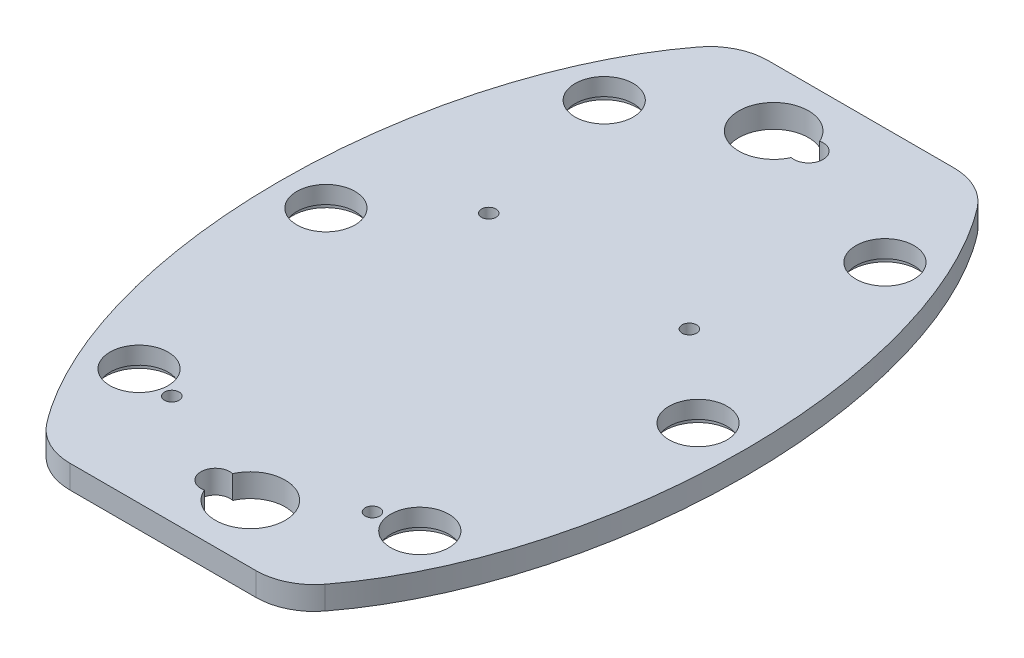
ISO-10303-21;
HEADER;
FILE_DESCRIPTION(('STEP AP214'),'2;1');
FILE_NAME('part.step','',(''),(''),'','','');
FILE_SCHEMA(('AUTOMOTIVE_DESIGN { 1 0 10303 214 1 1 1 1 }'));
ENDSEC;
DATA;
#1=APPLICATION_CONTEXT('core data for automotive mechanical design processes');
#2=APPLICATION_PROTOCOL_DEFINITION('international standard','automotive_design',2000,#1);
#3=PRODUCT_CONTEXT('',#1,'mechanical');
#4=PRODUCT('Part','Part','',(#3));
#5=PRODUCT_RELATED_PRODUCT_CATEGORY('part','',(#4));
#6=PRODUCT_DEFINITION_FORMATION('','',#4);
#7=PRODUCT_DEFINITION_CONTEXT('part definition',#1,'design');
#8=PRODUCT_DEFINITION('design','',#6,#7);
#9=PRODUCT_DEFINITION_SHAPE('','',#8);
#10=(LENGTH_UNIT() NAMED_UNIT(*) SI_UNIT(.MILLI.,.METRE.));
#11=(NAMED_UNIT(*) PLANE_ANGLE_UNIT() SI_UNIT($,.RADIAN.));
#12=(NAMED_UNIT(*) SI_UNIT($,.STERADIAN.) SOLID_ANGLE_UNIT());
#13=UNCERTAINTY_MEASURE_WITH_UNIT(LENGTH_MEASURE(1.E-05),#10,'distance_accuracy_value','');
#14=(GEOMETRIC_REPRESENTATION_CONTEXT(3) GLOBAL_UNCERTAINTY_ASSIGNED_CONTEXT((#13)) GLOBAL_UNIT_ASSIGNED_CONTEXT((#10,
#11,#12)) REPRESENTATION_CONTEXT('',''));
#15=CARTESIAN_POINT('',(0.,0.,0.));
#16=DIRECTION('',(0.,0.,1.));
#17=DIRECTION('',(1.,0.,0.));
#18=AXIS2_PLACEMENT_3D('',#15,#16,#17);
#19=CARTESIAN_POINT('',(-24.1414525476384,4.,-39.9999999999971));
#20=DIRECTION('',(0.,-1.,0.));
#21=DIRECTION('',(0.,0.,-1.));
#22=AXIS2_PLACEMENT_3D('',#19,#20,#21);
#23=CYLINDRICAL_SURFACE('',#22,5.);
#24=CARTESIAN_POINT('',(-24.1414525476384,4.,-39.9999999999971));
#25=DIRECTION('',(0.,1.,0.));
#26=DIRECTION('',(0.,0.,1.));
#27=AXIS2_PLACEMENT_3D('',#24,#25,#26);
#28=CIRCLE('',#27,5.);
#29=CARTESIAN_POINT('',(-24.1414525476384,4.,-34.9999999999971));
#30=VERTEX_POINT('',#29);
#31=EDGE_CURVE('E338',#30,#30,#28,.T.);
#32=ORIENTED_EDGE('',*,*,#31,.T.);
#33=EDGE_LOOP('',(#32));
#34=FACE_BOUND('',#33,.T.);
#35=CARTESIAN_POINT('',(-24.1414525476384,1.,-39.9999999999971));
#36=DIRECTION('',(0.,-1.,0.));
#37=DIRECTION('',(0.,0.,-1.));
#38=AXIS2_PLACEMENT_3D('',#35,#36,#37);
#39=CIRCLE('',#38,5.);
#40=CARTESIAN_POINT('',(-24.1414525476384,1.,-44.9999999999971));
#41=VERTEX_POINT('',#40);
#42=EDGE_CURVE('E54',#41,#41,#39,.T.);
#43=ORIENTED_EDGE('',*,*,#42,.T.);
#44=EDGE_LOOP('',(#43));
#45=FACE_BOUND('',#44,.T.);
#46=ADVANCED_FACE('F50',(#34,#45),#23,.F.);
#47=CARTESIAN_POINT('',(-24.141452547637,4.,40.));
#48=DIRECTION('',(0.,-1.,0.));
#49=DIRECTION('',(0.,0.,-1.));
#50=AXIS2_PLACEMENT_3D('',#47,#48,#49);
#51=CYLINDRICAL_SURFACE('',#50,5.);
#52=CARTESIAN_POINT('',(-24.141452547637,4.,40.));
#53=DIRECTION('',(0.,1.,0.));
#54=DIRECTION('',(0.,0.,1.));
#55=AXIS2_PLACEMENT_3D('',#52,#53,#54);
#56=CIRCLE('',#55,5.);
#57=CARTESIAN_POINT('',(-24.141452547637,4.,45.));
#58=VERTEX_POINT('',#57);
#59=EDGE_CURVE('E332',#58,#58,#56,.T.);
#60=ORIENTED_EDGE('',*,*,#59,.T.);
#61=EDGE_LOOP('',(#60));
#62=FACE_BOUND('',#61,.T.);
#63=CARTESIAN_POINT('',(-24.141452547637,1.,40.));
#64=DIRECTION('',(0.,-1.,0.));
#65=DIRECTION('',(0.,0.,-1.));
#66=AXIS2_PLACEMENT_3D('',#63,#64,#65);
#67=CIRCLE('',#66,5.);
#68=CARTESIAN_POINT('',(-24.141452547637,1.,35.));
#69=VERTEX_POINT('',#68);
#70=EDGE_CURVE('E191',#69,#69,#67,.T.);
#71=ORIENTED_EDGE('',*,*,#70,.T.);
#72=EDGE_LOOP('',(#71));
#73=FACE_BOUND('',#72,.T.);
#74=ADVANCED_FACE('F468',(#62,#73),#51,.F.);
#75=CARTESIAN_POINT('',(-32.,4.,0.));
#76=DIRECTION('',(0.,-1.,0.));
#77=DIRECTION('',(0.,0.,-1.));
#78=AXIS2_PLACEMENT_3D('',#75,#76,#77);
#79=CYLINDRICAL_SURFACE('',#78,5.);
#80=CARTESIAN_POINT('',(-32.,4.,0.));
#81=DIRECTION('',(0.,1.,0.));
#82=DIRECTION('',(0.,0.,1.));
#83=AXIS2_PLACEMENT_3D('',#80,#81,#82);
#84=CIRCLE('',#83,5.);
#85=CARTESIAN_POINT('',(-32.,4.,4.99999999999999));
#86=VERTEX_POINT('',#85);
#87=EDGE_CURVE('E328',#86,#86,#84,.T.);
#88=ORIENTED_EDGE('',*,*,#87,.T.);
#89=EDGE_LOOP('',(#88));
#90=FACE_BOUND('',#89,.T.);
#91=CARTESIAN_POINT('',(-32.,1.,0.));
#92=DIRECTION('',(0.,-1.,0.));
#93=DIRECTION('',(0.,0.,-1.));
#94=AXIS2_PLACEMENT_3D('',#91,#92,#93);
#95=CIRCLE('',#94,5.);
#96=CARTESIAN_POINT('',(-32.,1.,-5.));
#97=VERTEX_POINT('',#96);
#98=EDGE_CURVE('E186',#97,#97,#95,.T.);
#99=ORIENTED_EDGE('',*,*,#98,.T.);
#100=EDGE_LOOP('',(#99));
#101=FACE_BOUND('',#100,.T.);
#102=ADVANCED_FACE('F474',(#90,#101),#79,.F.);
#103=CARTESIAN_POINT('',(24.141452547637,4.,40.));
#104=DIRECTION('',(0.,-1.,0.));
#105=DIRECTION('',(0.,0.,-1.));
#106=AXIS2_PLACEMENT_3D('',#103,#104,#105);
#107=CYLINDRICAL_SURFACE('',#106,4.99999999999999);
#108=CARTESIAN_POINT('',(24.141452547637,4.,40.));
#109=DIRECTION('',(0.,1.,0.));
#110=DIRECTION('',(0.,0.,-1.));
#111=AXIS2_PLACEMENT_3D('',#108,#109,#110);
#112=CIRCLE('',#111,4.99999999999999);
#113=CARTESIAN_POINT('',(24.141452547637,4.,35.));
#114=VERTEX_POINT('',#113);
#115=EDGE_CURVE('E323',#114,#114,#112,.T.);
#116=ORIENTED_EDGE('',*,*,#115,.T.);
#117=EDGE_LOOP('',(#116));
#118=FACE_BOUND('',#117,.T.);
#119=CARTESIAN_POINT('',(24.141452547637,1.,40.));
#120=DIRECTION('',(0.,-1.,0.));
#121=DIRECTION('',(0.,0.,-1.));
#122=AXIS2_PLACEMENT_3D('',#119,#120,#121);
#123=CIRCLE('',#122,4.99999999999999);
#124=CARTESIAN_POINT('',(24.141452547637,1.,35.));
#125=VERTEX_POINT('',#124);
#126=EDGE_CURVE('E192',#125,#125,#123,.T.);
#127=ORIENTED_EDGE('',*,*,#126,.T.);
#128=EDGE_LOOP('',(#127));
#129=FACE_BOUND('',#128,.T.);
#130=ADVANCED_FACE('F923',(#118,#129),#107,.F.);
#131=CARTESIAN_POINT('',(32.,4.,0.));
#132=DIRECTION('',(0.,-1.,0.));
#133=DIRECTION('',(0.,0.,-1.));
#134=AXIS2_PLACEMENT_3D('',#131,#132,#133);
#135=CYLINDRICAL_SURFACE('',#134,5.);
#136=CARTESIAN_POINT('',(32.,4.,0.));
#137=DIRECTION('',(0.,1.,0.));
#138=DIRECTION('',(0.,0.,-1.));
#139=AXIS2_PLACEMENT_3D('',#136,#137,#138);
#140=CIRCLE('',#139,5.);
#141=CARTESIAN_POINT('',(32.,4.,-5.));
#142=VERTEX_POINT('',#141);
#143=EDGE_CURVE('E316',#142,#142,#140,.T.);
#144=ORIENTED_EDGE('',*,*,#143,.T.);
#145=EDGE_LOOP('',(#144));
#146=FACE_BOUND('',#145,.T.);
#147=CARTESIAN_POINT('',(32.,1.,0.));
#148=DIRECTION('',(0.,-1.,0.));
#149=DIRECTION('',(0.,0.,-1.));
#150=AXIS2_PLACEMENT_3D('',#147,#148,#149);
#151=CIRCLE('',#150,5.);
#152=CARTESIAN_POINT('',(32.,1.,-5.));
#153=VERTEX_POINT('',#152);
#154=EDGE_CURVE('E206',#153,#153,#151,.T.);
#155=ORIENTED_EDGE('',*,*,#154,.T.);
#156=EDGE_LOOP('',(#155));
#157=FACE_BOUND('',#156,.T.);
#158=ADVANCED_FACE('F914',(#146,#157),#135,.F.);
#159=CARTESIAN_POINT('',(24.1414525476384,4.,-39.9999999999971));
#160=DIRECTION('',(0.,-1.,0.));
#161=DIRECTION('',(0.,0.,-1.));
#162=AXIS2_PLACEMENT_3D('',#159,#160,#161);
#163=CYLINDRICAL_SURFACE('',#162,5.);
#164=CARTESIAN_POINT('',(24.1414525476384,4.,-39.9999999999971));
#165=DIRECTION('',(0.,1.,0.));
#166=DIRECTION('',(0.,0.,-1.));
#167=AXIS2_PLACEMENT_3D('',#164,#165,#166);
#168=CIRCLE('',#167,5.);
#169=CARTESIAN_POINT('',(24.1414525476384,4.,-44.9999999999971));
#170=VERTEX_POINT('',#169);
#171=EDGE_CURVE('E311',#170,#170,#168,.T.);
#172=ORIENTED_EDGE('',*,*,#171,.T.);
#173=EDGE_LOOP('',(#172));
#174=FACE_BOUND('',#173,.T.);
#175=CARTESIAN_POINT('',(24.1414525476384,1.,-39.9999999999971));
#176=DIRECTION('',(0.,-1.,0.));
#177=DIRECTION('',(0.,0.,-1.));
#178=AXIS2_PLACEMENT_3D('',#175,#176,#177);
#179=CIRCLE('',#178,5.);
#180=CARTESIAN_POINT('',(24.1414525476384,1.,-44.9999999999971));
#181=VERTEX_POINT('',#180);
#182=EDGE_CURVE('E202',#181,#181,#179,.T.);
#183=ORIENTED_EDGE('',*,*,#182,.T.);
#184=EDGE_LOOP('',(#183));
#185=FACE_BOUND('',#184,.T.);
#186=ADVANCED_FACE('F481',(#174,#185),#163,.F.);
#187=CARTESIAN_POINT('',(0.,4.,0.));
#188=DIRECTION('',(0.,1.,0.));
#189=DIRECTION('',(0.,0.,1.));
#190=AXIS2_PLACEMENT_3D('',#187,#188,#189);
#191=PLANE('',#190);
#192=CARTESIAN_POINT('',(-17.25,4.,41.25));
#193=DIRECTION('',(0.,1.,0.));
#194=DIRECTION('',(0.,0.,1.));
#195=AXIS2_PLACEMENT_3D('',#192,#193,#194);
#196=CIRCLE('',#195,1.25);
#197=CARTESIAN_POINT('',(-17.25,4.,42.5));
#198=VERTEX_POINT('',#197);
#199=EDGE_CURVE('E1033',#198,#198,#196,.T.);
#200=ORIENTED_EDGE('',*,*,#199,.F.);
#201=EDGE_LOOP('',(#200));
#202=FACE_BOUND('',#201,.T.);
#203=CARTESIAN_POINT('',(-17.25,4.,-13.25));
#204=DIRECTION('',(0.,1.,0.));
#205=DIRECTION('',(0.,0.,1.));
#206=AXIS2_PLACEMENT_3D('',#203,#204,#205);
#207=CIRCLE('',#206,1.25);
#208=CARTESIAN_POINT('',(-17.25,4.,-12.));
#209=VERTEX_POINT('',#208);
#210=EDGE_CURVE('E1025',#209,#209,#207,.T.);
#211=ORIENTED_EDGE('',*,*,#210,.F.);
#212=EDGE_LOOP('',(#211));
#213=FACE_BOUND('',#212,.T.);
#214=CARTESIAN_POINT('',(17.25,4.,-13.25));
#215=DIRECTION('',(0.,1.,0.));
#216=DIRECTION('',(0.,0.,1.));
#217=AXIS2_PLACEMENT_3D('',#214,#215,#216);
#218=CIRCLE('',#217,1.25);
#219=CARTESIAN_POINT('',(17.25,4.,-12.));
#220=VERTEX_POINT('',#219);
#221=EDGE_CURVE('E1017',#220,#220,#218,.T.);
#222=ORIENTED_EDGE('',*,*,#221,.F.);
#223=EDGE_LOOP('',(#222));
#224=FACE_BOUND('',#223,.T.);
#225=CARTESIAN_POINT('',(17.25,4.,41.25));
#226=DIRECTION('',(0.,1.,0.));
#227=DIRECTION('',(0.,0.,1.));
#228=AXIS2_PLACEMENT_3D('',#225,#226,#227);
#229=CIRCLE('',#228,1.25);
#230=CARTESIAN_POINT('',(17.25,4.,42.5));
#231=VERTEX_POINT('',#230);
#232=EDGE_CURVE('E1010',#231,#231,#229,.T.);
#233=ORIENTED_EDGE('',*,*,#232,.F.);
#234=EDGE_LOOP('',(#233));
#235=FACE_BOUND('',#234,.T.);
#236=ORIENTED_EDGE('',*,*,#143,.F.);
#237=EDGE_LOOP('',(#236));
#238=FACE_BOUND('',#237,.T.);
#239=ORIENTED_EDGE('',*,*,#87,.F.);
#240=EDGE_LOOP('',(#239));
#241=FACE_BOUND('',#240,.T.);
#242=ORIENTED_EDGE('',*,*,#31,.F.);
#243=EDGE_LOOP('',(#242));
#244=FACE_BOUND('',#243,.T.);
#245=CARTESIAN_POINT('',(-15.999553812101,4.,50.));
#246=DIRECTION('',(0.,1.,0.));
#247=DIRECTION('',(0.,0.,-1.));
#248=AXIS2_PLACEMENT_3D('',#245,#246,#247);
#249=CIRCLE('',#248,9.99999999999999);
#250=CARTESIAN_POINT('',(-23.943015979705,4.,56.0746529770716));
#251=VERTEX_POINT('',#250);
#252=CARTESIAN_POINT('',(-15.999553812101,4.,60.));
#253=VERTEX_POINT('',#252);
#254=EDGE_CURVE('E343',#251,#253,#249,.T.);
#255=ORIENTED_EDGE('',*,*,#254,.T.);
#256=DIRECTION('',(1.,0.,0.));
#257=VECTOR('',#256,1.);
#258=CARTESIAN_POINT('',(-15.999553812101,4.,60.));
#259=LINE('',#258,#257);
#260=CARTESIAN_POINT('',(15.999553812101,4.,60.));
#261=VERTEX_POINT('',#260);
#262=EDGE_CURVE('E347',#253,#261,#259,.T.);
#263=ORIENTED_EDGE('',*,*,#262,.T.);
#264=CARTESIAN_POINT('',(15.999553812101,4.,50.));
#265=DIRECTION('',(0.,1.,0.));
#266=DIRECTION('',(0.,0.,1.));
#267=AXIS2_PLACEMENT_3D('',#264,#265,#266);
#268=CIRCLE('',#267,10.);
#269=CARTESIAN_POINT('',(23.943015979705,4.,56.0746529770716));
#270=VERTEX_POINT('',#269);
#271=EDGE_CURVE('E352',#261,#270,#268,.T.);
#272=ORIENTED_EDGE('',*,*,#271,.T.);
#273=CARTESIAN_POINT('',(0.,4.,0.));
#274=DIRECTION('',(0.,1.,0.));
#275=DIRECTION('',(0.,0.,-1.));
#276=AXIS2_PLACEMENT_3D('',#273,#274,#275);
#277=ELLIPSE('',#276,70.,40.);
#278=CARTESIAN_POINT('',(23.943015979705,4.,-56.0746529770716));
#279=VERTEX_POINT('',#278);
#280=EDGE_CURVE('E446',#270,#279,#277,.T.);
#281=ORIENTED_EDGE('',*,*,#280,.T.);
#282=CARTESIAN_POINT('',(15.999553812101,4.,-50.));
#283=DIRECTION('',(0.,1.,0.));
#284=DIRECTION('',(0.,0.,-1.));
#285=AXIS2_PLACEMENT_3D('',#282,#283,#284);
#286=CIRCLE('',#285,10.);
#287=CARTESIAN_POINT('',(15.999553812101,4.,-60.));
#288=VERTEX_POINT('',#287);
#289=EDGE_CURVE('E442',#279,#288,#286,.T.);
#290=ORIENTED_EDGE('',*,*,#289,.T.);
#291=DIRECTION('',(-1.,0.,0.));
#292=VECTOR('',#291,1.);
#293=CARTESIAN_POINT('',(-15.999553812101,4.,-60.));
#294=LINE('',#293,#292);
#295=CARTESIAN_POINT('',(-15.999553812101,4.,-60.));
#296=VERTEX_POINT('',#295);
#297=EDGE_CURVE('E440',#288,#296,#294,.T.);
#298=ORIENTED_EDGE('',*,*,#297,.T.);
#299=CARTESIAN_POINT('',(-15.999553812101,4.,-50.));
#300=DIRECTION('',(0.,1.,0.));
#301=DIRECTION('',(0.,0.,1.));
#302=AXIS2_PLACEMENT_3D('',#299,#300,#301);
#303=CIRCLE('',#302,10.);
#304=CARTESIAN_POINT('',(-23.943015979705,4.,-56.0746529770716));
#305=VERTEX_POINT('',#304);
#306=EDGE_CURVE('E437',#296,#305,#303,.T.);
#307=ORIENTED_EDGE('',*,*,#306,.T.);
#308=CARTESIAN_POINT('',(0.,4.,0.));
#309=DIRECTION('',(0.,1.,0.));
#310=DIRECTION('',(0.,0.,-1.));
#311=AXIS2_PLACEMENT_3D('',#308,#309,#310);
#312=ELLIPSE('',#311,70.,40.);
#313=EDGE_CURVE('E382',#305,#251,#312,.T.);
#314=ORIENTED_EDGE('',*,*,#313,.T.);
#315=EDGE_LOOP('',(#255,#263,#272,#281,#290,#298,#307,#314));
#316=FACE_BOUND('',#315,.T.);
#317=ORIENTED_EDGE('',*,*,#59,.F.);
#318=EDGE_LOOP('',(#317));
#319=FACE_BOUND('',#318,.T.);
#320=ORIENTED_EDGE('',*,*,#115,.F.);
#321=EDGE_LOOP('',(#320));
#322=FACE_BOUND('',#321,.T.);
#323=ORIENTED_EDGE('',*,*,#171,.F.);
#324=EDGE_LOOP('',(#323));
#325=FACE_BOUND('',#324,.T.);
#326=CARTESIAN_POINT('',(-5.,4.,-50.));
#327=DIRECTION('',(0.,1.,0.));
#328=DIRECTION('',(0.,0.,1.));
#329=AXIS2_PLACEMENT_3D('',#326,#327,#328);
#330=CIRCLE('',#329,6.);
#331=CARTESIAN_POINT('',(0.479166666666667,4.,-52.445144707147));
#332=VERTEX_POINT('',#331);
#333=CARTESIAN_POINT('',(0.479166666666667,4.,-47.554855292853));
#334=VERTEX_POINT('',#333);
#335=EDGE_CURVE('E305',#332,#334,#330,.T.);
#336=ORIENTED_EDGE('',*,*,#335,.F.);
#337=CARTESIAN_POINT('',(1.00000000000001,4.,-50.));
#338=DIRECTION('',(0.,1.,0.));
#339=DIRECTION('',(0.,0.,1.));
#340=AXIS2_PLACEMENT_3D('',#337,#338,#339);
#341=CIRCLE('',#340,2.5);
#342=EDGE_CURVE('E290',#334,#332,#341,.T.);
#343=ORIENTED_EDGE('',*,*,#342,.F.);
#344=EDGE_LOOP('',(#336,#343));
#345=FACE_BOUND('',#344,.T.);
#346=CARTESIAN_POINT('',(5.,4.,50.));
#347=DIRECTION('',(0.,1.,0.));
#348=DIRECTION('',(0.,0.,1.));
#349=AXIS2_PLACEMENT_3D('',#346,#347,#348);
#350=CIRCLE('',#349,6.);
#351=CARTESIAN_POINT('',(-0.47916666666667,4.,52.445144707147));
#352=VERTEX_POINT('',#351);
#353=CARTESIAN_POINT('',(-0.479166666666662,4.,47.554855292853));
#354=VERTEX_POINT('',#353);
#355=EDGE_CURVE('E141',#352,#354,#350,.T.);
#356=ORIENTED_EDGE('',*,*,#355,.F.);
#357=CARTESIAN_POINT('',(-0.999999999999998,4.,50.));
#358=DIRECTION('',(0.,1.,0.));
#359=DIRECTION('',(0.,0.,1.));
#360=AXIS2_PLACEMENT_3D('',#357,#358,#359);
#361=CIRCLE('',#360,2.5);
#362=EDGE_CURVE('E148',#354,#352,#361,.T.);
#363=ORIENTED_EDGE('',*,*,#362,.F.);
#364=EDGE_LOOP('',(#356,#363));
#365=FACE_BOUND('',#364,.T.);
#366=ADVANCED_FACE('F153',(#202,#213,#224,#235,#238,#241,#244,#316,#319,#322,#325,#345,#365),
#191,.T.);
#367=CARTESIAN_POINT('',(0.,0.,0.));
#368=DIRECTION('',(0.,1.,0.));
#369=DIRECTION('',(0.,0.,1.));
#370=AXIS2_PLACEMENT_3D('',#367,#368,#369);
#371=PLANE('',#370);
#372=CARTESIAN_POINT('',(-17.25,0.,41.25));
#373=DIRECTION('',(0.,1.,0.));
#374=DIRECTION('',(0.,0.,1.));
#375=AXIS2_PLACEMENT_3D('',#372,#373,#374);
#376=CIRCLE('',#375,1.25);
#377=CARTESIAN_POINT('',(-17.25,0.,42.5));
#378=VERTEX_POINT('',#377);
#379=EDGE_CURVE('E1029',#378,#378,#376,.F.);
#380=ORIENTED_EDGE('',*,*,#379,.F.);
#381=EDGE_LOOP('',(#380));
#382=FACE_BOUND('',#381,.T.);
#383=CARTESIAN_POINT('',(-17.25,0.,-13.25));
#384=DIRECTION('',(0.,1.,0.));
#385=DIRECTION('',(0.,0.,1.));
#386=AXIS2_PLACEMENT_3D('',#383,#384,#385);
#387=CIRCLE('',#386,1.25);
#388=CARTESIAN_POINT('',(-17.25,0.,-12.));
#389=VERTEX_POINT('',#388);
#390=EDGE_CURVE('E1021',#389,#389,#387,.F.);
#391=ORIENTED_EDGE('',*,*,#390,.F.);
#392=EDGE_LOOP('',(#391));
#393=FACE_BOUND('',#392,.T.);
#394=CARTESIAN_POINT('',(17.25,0.,-13.25));
#395=DIRECTION('',(0.,1.,0.));
#396=DIRECTION('',(0.,0.,1.));
#397=AXIS2_PLACEMENT_3D('',#394,#395,#396);
#398=CIRCLE('',#397,1.25);
#399=CARTESIAN_POINT('',(17.25,0.,-12.));
#400=VERTEX_POINT('',#399);
#401=EDGE_CURVE('E1013',#400,#400,#398,.F.);
#402=ORIENTED_EDGE('',*,*,#401,.F.);
#403=EDGE_LOOP('',(#402));
#404=FACE_BOUND('',#403,.T.);
#405=CARTESIAN_POINT('',(17.25,0.,41.25));
#406=DIRECTION('',(0.,1.,0.));
#407=DIRECTION('',(0.,0.,1.));
#408=AXIS2_PLACEMENT_3D('',#405,#406,#407);
#409=CIRCLE('',#408,1.25);
#410=CARTESIAN_POINT('',(17.25,0.,42.5));
#411=VERTEX_POINT('',#410);
#412=EDGE_CURVE('E224',#411,#411,#409,.F.);
#413=ORIENTED_EDGE('',*,*,#412,.F.);
#414=EDGE_LOOP('',(#413));
#415=FACE_BOUND('',#414,.T.);
#416=CARTESIAN_POINT('',(24.1414525476384,0.,-39.9999999999971));
#417=DIRECTION('',(0.,-1.,0.));
#418=DIRECTION('',(0.,0.,-1.));
#419=AXIS2_PLACEMENT_3D('',#416,#417,#418);
#420=CIRCLE('',#419,5.75);
#421=CARTESIAN_POINT('',(24.1414525476384,0.,-45.7499999999971));
#422=VERTEX_POINT('',#421);
#423=EDGE_CURVE('E230',#422,#422,#420,.T.);
#424=ORIENTED_EDGE('',*,*,#423,.F.);
#425=EDGE_LOOP('',(#424));
#426=FACE_BOUND('',#425,.T.);
#427=CARTESIAN_POINT('',(32.,0.,0.));
#428=DIRECTION('',(0.,-1.,0.));
#429=DIRECTION('',(0.,0.,-1.));
#430=AXIS2_PLACEMENT_3D('',#427,#428,#429);
#431=CIRCLE('',#430,5.75);
#432=CARTESIAN_POINT('',(32.,0.,-5.75));
#433=VERTEX_POINT('',#432);
#434=EDGE_CURVE('E546',#433,#433,#431,.T.);
#435=ORIENTED_EDGE('',*,*,#434,.F.);
#436=EDGE_LOOP('',(#435));
#437=FACE_BOUND('',#436,.T.);
#438=CARTESIAN_POINT('',(24.141452547637,0.,40.));
#439=DIRECTION('',(0.,-1.,0.));
#440=DIRECTION('',(0.,0.,-1.));
#441=AXIS2_PLACEMENT_3D('',#438,#439,#440);
#442=CIRCLE('',#441,5.75);
#443=CARTESIAN_POINT('',(24.141452547637,0.,34.25));
#444=VERTEX_POINT('',#443);
#445=EDGE_CURVE('E242',#444,#444,#442,.T.);
#446=ORIENTED_EDGE('',*,*,#445,.F.);
#447=EDGE_LOOP('',(#446));
#448=FACE_BOUND('',#447,.T.);
#449=CARTESIAN_POINT('',(-24.141452547637,0.,40.));
#450=DIRECTION('',(0.,-1.,0.));
#451=DIRECTION('',(0.,0.,-1.));
#452=AXIS2_PLACEMENT_3D('',#449,#450,#451);
#453=CIRCLE('',#452,5.75);
#454=CARTESIAN_POINT('',(-24.141452547637,0.,34.25));
#455=VERTEX_POINT('',#454);
#456=EDGE_CURVE('E253',#455,#455,#453,.T.);
#457=ORIENTED_EDGE('',*,*,#456,.F.);
#458=EDGE_LOOP('',(#457));
#459=FACE_BOUND('',#458,.T.);
#460=CARTESIAN_POINT('',(-32.,0.,0.));
#461=DIRECTION('',(0.,-1.,0.));
#462=DIRECTION('',(0.,0.,-1.));
#463=AXIS2_PLACEMENT_3D('',#460,#461,#462);
#464=CIRCLE('',#463,5.75);
#465=CARTESIAN_POINT('',(-32.,0.,-5.75));
#466=VERTEX_POINT('',#465);
#467=EDGE_CURVE('E217',#466,#466,#464,.T.);
#468=ORIENTED_EDGE('',*,*,#467,.F.);
#469=EDGE_LOOP('',(#468));
#470=FACE_BOUND('',#469,.T.);
#471=CARTESIAN_POINT('',(-24.1414525476384,0.,-39.9999999999971));
#472=DIRECTION('',(0.,-1.,0.));
#473=DIRECTION('',(0.,0.,-1.));
#474=AXIS2_PLACEMENT_3D('',#471,#472,#473);
#475=CIRCLE('',#474,5.75);
#476=CARTESIAN_POINT('',(-24.1414525476384,0.,-45.7499999999971));
#477=VERTEX_POINT('',#476);
#478=EDGE_CURVE('E162',#477,#477,#475,.T.);
#479=ORIENTED_EDGE('',*,*,#478,.F.);
#480=EDGE_LOOP('',(#479));
#481=FACE_BOUND('',#480,.T.);
#482=CARTESIAN_POINT('',(1.00000000000001,0.,-50.));
#483=DIRECTION('',(0.,1.,0.));
#484=DIRECTION('',(0.,0.,1.));
#485=AXIS2_PLACEMENT_3D('',#482,#483,#484);
#486=CIRCLE('',#485,2.5);
#487=CARTESIAN_POINT('',(0.479166666666667,0.,-47.554855292853));
#488=VERTEX_POINT('',#487);
#489=CARTESIAN_POINT('',(0.479166666666667,0.,-52.445144707147));
#490=VERTEX_POINT('',#489);
#491=EDGE_CURVE('E277',#488,#490,#486,.T.);
#492=ORIENTED_EDGE('',*,*,#491,.T.);
#493=CARTESIAN_POINT('',(-5.,0.,-50.));
#494=DIRECTION('',(0.,1.,0.));
#495=DIRECTION('',(0.,0.,1.));
#496=AXIS2_PLACEMENT_3D('',#493,#494,#495);
#497=CIRCLE('',#496,6.);
#498=EDGE_CURVE('E286',#490,#488,#497,.T.);
#499=ORIENTED_EDGE('',*,*,#498,.T.);
#500=EDGE_LOOP('',(#492,#499));
#501=FACE_BOUND('',#500,.T.);
#502=CARTESIAN_POINT('',(-15.999553812101,0.,50.));
#503=DIRECTION('',(0.,1.,0.));
#504=DIRECTION('',(0.,0.,-1.));
#505=AXIS2_PLACEMENT_3D('',#502,#503,#504);
#506=CIRCLE('',#505,9.99999999999999);
#507=CARTESIAN_POINT('',(-23.943015979705,0.,56.0746529770716));
#508=VERTEX_POINT('',#507);
#509=CARTESIAN_POINT('',(-15.999553812101,0.,60.));
#510=VERTEX_POINT('',#509);
#511=EDGE_CURVE('E282',#508,#510,#506,.T.);
#512=ORIENTED_EDGE('',*,*,#511,.F.);
#513=CARTESIAN_POINT('',(0.,0.,0.));
#514=DIRECTION('',(0.,1.,0.));
#515=DIRECTION('',(0.,0.,-1.));
#516=AXIS2_PLACEMENT_3D('',#513,#514,#515);
#517=ELLIPSE('',#516,70.,40.);
#518=CARTESIAN_POINT('',(-23.943015979705,0.,-56.0746529770716));
#519=VERTEX_POINT('',#518);
#520=EDGE_CURVE('E348',#519,#508,#517,.T.);
#521=ORIENTED_EDGE('',*,*,#520,.F.);
#522=CARTESIAN_POINT('',(-15.999553812101,0.,-50.));
#523=DIRECTION('',(0.,1.,0.));
#524=DIRECTION('',(0.,0.,1.));
#525=AXIS2_PLACEMENT_3D('',#522,#523,#524);
#526=CIRCLE('',#525,10.);
#527=CARTESIAN_POINT('',(-15.999553812101,0.,-60.));
#528=VERTEX_POINT('',#527);
#529=EDGE_CURVE('E386',#528,#519,#526,.T.);
#530=ORIENTED_EDGE('',*,*,#529,.F.);
#531=DIRECTION('',(-1.,0.,0.));
#532=VECTOR('',#531,1.);
#533=CARTESIAN_POINT('',(-15.999553812101,0.,-60.));
#534=LINE('',#533,#532);
#535=CARTESIAN_POINT('',(15.999553812101,0.,-60.));
#536=VERTEX_POINT('',#535);
#537=EDGE_CURVE('E416',#536,#528,#534,.T.);
#538=ORIENTED_EDGE('',*,*,#537,.F.);
#539=CARTESIAN_POINT('',(15.999553812101,0.,-50.));
#540=DIRECTION('',(0.,1.,0.));
#541=DIRECTION('',(0.,0.,-1.));
#542=AXIS2_PLACEMENT_3D('',#539,#540,#541);
#543=CIRCLE('',#542,10.);
#544=CARTESIAN_POINT('',(23.943015979705,0.,-56.0746529770716));
#545=VERTEX_POINT('',#544);
#546=EDGE_CURVE('E413',#545,#536,#543,.T.);
#547=ORIENTED_EDGE('',*,*,#546,.F.);
#548=CARTESIAN_POINT('',(0.,0.,0.));
#549=DIRECTION('',(0.,1.,0.));
#550=DIRECTION('',(0.,0.,-1.));
#551=AXIS2_PLACEMENT_3D('',#548,#549,#550);
#552=ELLIPSE('',#551,70.,40.);
#553=CARTESIAN_POINT('',(23.943015979705,0.,56.0746529770716));
#554=VERTEX_POINT('',#553);
#555=EDGE_CURVE('E406',#554,#545,#552,.T.);
#556=ORIENTED_EDGE('',*,*,#555,.F.);
#557=CARTESIAN_POINT('',(15.999553812101,0.,50.));
#558=DIRECTION('',(0.,1.,0.));
#559=DIRECTION('',(0.,0.,1.));
#560=AXIS2_PLACEMENT_3D('',#557,#558,#559);
#561=CIRCLE('',#560,10.);
#562=CARTESIAN_POINT('',(15.999553812101,0.,60.));
#563=VERTEX_POINT('',#562);
#564=EDGE_CURVE('E402',#563,#554,#561,.T.);
#565=ORIENTED_EDGE('',*,*,#564,.F.);
#566=DIRECTION('',(1.,0.,0.));
#567=VECTOR('',#566,1.);
#568=CARTESIAN_POINT('',(-15.999553812101,0.,60.));
#569=LINE('',#568,#567);
#570=EDGE_CURVE('E396',#510,#563,#569,.T.);
#571=ORIENTED_EDGE('',*,*,#570,.F.);
#572=EDGE_LOOP('',(#512,#521,#530,#538,#547,#556,#565,#571));
#573=FACE_BOUND('',#572,.T.);
#574=CARTESIAN_POINT('',(-0.999999999999998,0.,50.));
#575=DIRECTION('',(0.,1.,0.));
#576=DIRECTION('',(0.,0.,1.));
#577=AXIS2_PLACEMENT_3D('',#574,#575,#576);
#578=CIRCLE('',#577,2.5);
#579=CARTESIAN_POINT('',(-0.479166666666664,0.,47.554855292853));
#580=VERTEX_POINT('',#579);
#581=CARTESIAN_POINT('',(-0.47916666666667,0.,52.445144707147));
#582=VERTEX_POINT('',#581);
#583=EDGE_CURVE('E75',#580,#582,#578,.T.);
#584=ORIENTED_EDGE('',*,*,#583,.T.);
#585=CARTESIAN_POINT('',(5.,0.,50.));
#586=DIRECTION('',(0.,1.,0.));
#587=DIRECTION('',(0.,0.,1.));
#588=AXIS2_PLACEMENT_3D('',#585,#586,#587);
#589=CIRCLE('',#588,6.);
#590=EDGE_CURVE('E155',#582,#580,#589,.T.);
#591=ORIENTED_EDGE('',*,*,#590,.T.);
#592=EDGE_LOOP('',(#584,#591));
#593=FACE_BOUND('',#592,.T.);
#594=ADVANCED_FACE('F269',(#382,#393,#404,#415,#426,#437,#448,#459,#470,#481,#501,#573,#593),
#371,.F.);
#595=CARTESIAN_POINT('',(-15.999553812101,4.,50.));
#596=DIRECTION('',(0.,-1.,0.));
#597=DIRECTION('',(0.,0.,-1.));
#598=AXIS2_PLACEMENT_3D('',#595,#596,#597);
#599=CYLINDRICAL_SURFACE('',#598,9.99999999999999);
#600=ORIENTED_EDGE('',*,*,#511,.T.);
#601=DIRECTION('',(0.,-1.,0.));
#602=VECTOR('',#601,1.);
#603=CARTESIAN_POINT('',(-15.999553812101,4.,60.));
#604=LINE('',#603,#602);
#605=EDGE_CURVE('E12',#253,#510,#604,.T.);
#606=ORIENTED_EDGE('',*,*,#605,.F.);
#607=ORIENTED_EDGE('',*,*,#254,.F.);
#608=DIRECTION('',(0.,-1.,0.));
#609=VECTOR('',#608,1.);
#610=CARTESIAN_POINT('',(-23.943015979705,4.,56.0746529770716));
#611=LINE('',#610,#609);
#612=EDGE_CURVE('E378',#251,#508,#611,.T.);
#613=ORIENTED_EDGE('',*,*,#612,.T.);
#614=EDGE_LOOP('',(#600,#606,#607,#613));
#615=FACE_BOUND('',#614,.T.);
#616=ADVANCED_FACE('F52',(#615),#599,.T.);
#617=CARTESIAN_POINT('',(-15.999553812101,4.,60.));
#618=DIRECTION('',(0.,0.,-1.));
#619=DIRECTION('',(-1.,0.,0.));
#620=AXIS2_PLACEMENT_3D('',#617,#618,#619);
#621=PLANE('',#620);
#622=ORIENTED_EDGE('',*,*,#570,.T.);
#623=DIRECTION('',(0.,-1.,0.));
#624=VECTOR('',#623,1.);
#625=CARTESIAN_POINT('',(15.999553812101,4.,60.));
#626=LINE('',#625,#624);
#627=EDGE_CURVE('E61',#261,#563,#626,.T.);
#628=ORIENTED_EDGE('',*,*,#627,.F.);
#629=ORIENTED_EDGE('',*,*,#262,.F.);
#630=ORIENTED_EDGE('',*,*,#605,.T.);
#631=EDGE_LOOP('',(#622,#628,#629,#630));
#632=FACE_BOUND('',#631,.T.);
#633=ADVANCED_FACE('F459',(#632),#621,.F.);
#634=CARTESIAN_POINT('',(15.999553812101,4.,50.));
#635=DIRECTION('',(0.,-1.,0.));
#636=DIRECTION('',(0.,0.,-1.));
#637=AXIS2_PLACEMENT_3D('',#634,#635,#636);
#638=CYLINDRICAL_SURFACE('',#637,10.);
#639=ORIENTED_EDGE('',*,*,#564,.T.);
#640=DIRECTION('',(0.,-1.,0.));
#641=VECTOR('',#640,1.);
#642=CARTESIAN_POINT('',(23.943015979705,4.,56.0746529770716));
#643=LINE('',#642,#641);
#644=EDGE_CURVE('E358',#270,#554,#643,.T.);
#645=ORIENTED_EDGE('',*,*,#644,.F.);
#646=ORIENTED_EDGE('',*,*,#271,.F.);
#647=ORIENTED_EDGE('',*,*,#627,.T.);
#648=EDGE_LOOP('',(#639,#645,#646,#647));
#649=FACE_BOUND('',#648,.T.);
#650=ADVANCED_FACE('F455',(#649),#638,.T.);
#651=DIRECTION('',(0.,-1.,0.));
#652=VECTOR('',#651,1.);
#653=SURFACE_OF_LINEAR_EXTRUSION('',#277,#652);
#654=ORIENTED_EDGE('',*,*,#555,.T.);
#655=DIRECTION('',(0.,-1.,0.));
#656=VECTOR('',#655,1.);
#657=CARTESIAN_POINT('',(23.943015979705,4.,-56.0746529770716));
#658=LINE('',#657,#656);
#659=EDGE_CURVE('E362',#279,#545,#658,.T.);
#660=ORIENTED_EDGE('',*,*,#659,.F.);
#661=ORIENTED_EDGE('',*,*,#280,.F.);
#662=ORIENTED_EDGE('',*,*,#644,.T.);
#663=EDGE_LOOP('',(#654,#660,#661,#662));
#664=FACE_BOUND('',#663,.T.);
#665=ADVANCED_FACE('F450',(#664),#653,.F.);
#666=CARTESIAN_POINT('',(15.999553812101,4.,-50.));
#667=DIRECTION('',(0.,-1.,0.));
#668=DIRECTION('',(0.,0.,-1.));
#669=AXIS2_PLACEMENT_3D('',#666,#667,#668);
#670=CYLINDRICAL_SURFACE('',#669,10.);
#671=ORIENTED_EDGE('',*,*,#546,.T.);
#672=DIRECTION('',(0.,-1.,0.));
#673=VECTOR('',#672,1.);
#674=CARTESIAN_POINT('',(15.999553812101,4.,-60.));
#675=LINE('',#674,#673);
#676=EDGE_CURVE('E366',#288,#536,#675,.T.);
#677=ORIENTED_EDGE('',*,*,#676,.F.);
#678=ORIENTED_EDGE('',*,*,#289,.F.);
#679=ORIENTED_EDGE('',*,*,#659,.T.);
#680=EDGE_LOOP('',(#671,#677,#678,#679));
#681=FACE_BOUND('',#680,.T.);
#682=ADVANCED_FACE('F454',(#681),#670,.T.);
#683=CARTESIAN_POINT('',(-15.999553812101,4.,-60.));
#684=DIRECTION('',(0.,0.,1.));
#685=DIRECTION('',(1.,0.,0.));
#686=AXIS2_PLACEMENT_3D('',#683,#684,#685);
#687=PLANE('',#686);
#688=ORIENTED_EDGE('',*,*,#537,.T.);
#689=DIRECTION('',(0.,-1.,0.));
#690=VECTOR('',#689,1.);
#691=CARTESIAN_POINT('',(-15.999553812101,4.,-60.));
#692=LINE('',#691,#690);
#693=EDGE_CURVE('E370',#296,#528,#692,.T.);
#694=ORIENTED_EDGE('',*,*,#693,.F.);
#695=ORIENTED_EDGE('',*,*,#297,.F.);
#696=ORIENTED_EDGE('',*,*,#676,.T.);
#697=EDGE_LOOP('',(#688,#694,#695,#696));
#698=FACE_BOUND('',#697,.T.);
#699=ADVANCED_FACE('F488',(#698),#687,.F.);
#700=CARTESIAN_POINT('',(-15.999553812101,4.,-50.));
#701=DIRECTION('',(0.,-1.,0.));
#702=DIRECTION('',(0.,0.,-1.));
#703=AXIS2_PLACEMENT_3D('',#700,#701,#702);
#704=CYLINDRICAL_SURFACE('',#703,10.);
#705=ORIENTED_EDGE('',*,*,#529,.T.);
#706=DIRECTION('',(0.,-1.,0.));
#707=VECTOR('',#706,1.);
#708=CARTESIAN_POINT('',(-23.943015979705,4.,-56.0746529770716));
#709=LINE('',#708,#707);
#710=EDGE_CURVE('E374',#305,#519,#709,.T.);
#711=ORIENTED_EDGE('',*,*,#710,.F.);
#712=ORIENTED_EDGE('',*,*,#306,.F.);
#713=ORIENTED_EDGE('',*,*,#693,.T.);
#714=EDGE_LOOP('',(#705,#711,#712,#713));
#715=FACE_BOUND('',#714,.T.);
#716=ADVANCED_FACE('F428',(#715),#704,.T.);
#717=DIRECTION('',(0.,-1.,0.));
#718=VECTOR('',#717,1.);
#719=SURFACE_OF_LINEAR_EXTRUSION('',#312,#718);
#720=ORIENTED_EDGE('',*,*,#520,.T.);
#721=ORIENTED_EDGE('',*,*,#612,.F.);
#722=ORIENTED_EDGE('',*,*,#313,.F.);
#723=ORIENTED_EDGE('',*,*,#710,.T.);
#724=EDGE_LOOP('',(#720,#721,#722,#723));
#725=FACE_BOUND('',#724,.T.);
#726=ADVANCED_FACE('F432',(#725),#719,.F.);
#727=CARTESIAN_POINT('',(1.00000000000001,4.,-50.));
#728=DIRECTION('',(0.,-1.,0.));
#729=DIRECTION('',(0.,0.,-1.));
#730=AXIS2_PLACEMENT_3D('',#727,#728,#729);
#731=CYLINDRICAL_SURFACE('',#730,2.5);
#732=ORIENTED_EDGE('',*,*,#491,.F.);
#733=DIRECTION('',(0.,-1.,0.));
#734=VECTOR('',#733,1.);
#735=CARTESIAN_POINT('',(0.479166666666667,4.,-47.554855292853));
#736=LINE('',#735,#734);
#737=EDGE_CURVE('E300',#334,#488,#736,.T.);
#738=ORIENTED_EDGE('',*,*,#737,.F.);
#739=ORIENTED_EDGE('',*,*,#342,.T.);
#740=DIRECTION('',(0.,-1.,0.));
#741=VECTOR('',#740,1.);
#742=CARTESIAN_POINT('',(0.479166666666667,4.,-52.445144707147));
#743=LINE('',#742,#741);
#744=EDGE_CURVE('E304',#332,#490,#743,.T.);
#745=ORIENTED_EDGE('',*,*,#744,.T.);
#746=EDGE_LOOP('',(#732,#738,#739,#745));
#747=FACE_BOUND('',#746,.T.);
#748=ADVANCED_FACE('F486',(#747),#731,.F.);
#749=CARTESIAN_POINT('',(-5.,4.,-50.));
#750=DIRECTION('',(0.,-1.,0.));
#751=DIRECTION('',(0.,0.,-1.));
#752=AXIS2_PLACEMENT_3D('',#749,#750,#751);
#753=CYLINDRICAL_SURFACE('',#752,6.);
#754=ORIENTED_EDGE('',*,*,#498,.F.);
#755=ORIENTED_EDGE('',*,*,#744,.F.);
#756=ORIENTED_EDGE('',*,*,#335,.T.);
#757=ORIENTED_EDGE('',*,*,#737,.T.);
#758=EDGE_LOOP('',(#754,#755,#756,#757));
#759=FACE_BOUND('',#758,.T.);
#760=ADVANCED_FACE('F589',(#759),#753,.F.);
#761=CARTESIAN_POINT('',(-0.999999999999998,4.,50.));
#762=DIRECTION('',(0.,-1.,0.));
#763=DIRECTION('',(0.,0.,-1.));
#764=AXIS2_PLACEMENT_3D('',#761,#762,#763);
#765=CYLINDRICAL_SURFACE('',#764,2.5);
#766=ORIENTED_EDGE('',*,*,#583,.F.);
#767=DIRECTION('',(0.,-1.,0.));
#768=VECTOR('',#767,1.);
#769=CARTESIAN_POINT('',(-0.479166666666662,4.,47.554855292853));
#770=LINE('',#769,#768);
#771=EDGE_CURVE('E143',#354,#580,#770,.T.);
#772=ORIENTED_EDGE('',*,*,#771,.F.);
#773=ORIENTED_EDGE('',*,*,#362,.T.);
#774=DIRECTION('',(0.,-1.,0.));
#775=VECTOR('',#774,1.);
#776=CARTESIAN_POINT('',(-0.47916666666667,4.,52.445144707147));
#777=LINE('',#776,#775);
#778=EDGE_CURVE('E68',#352,#582,#777,.T.);
#779=ORIENTED_EDGE('',*,*,#778,.T.);
#780=EDGE_LOOP('',(#766,#772,#773,#779));
#781=FACE_BOUND('',#780,.T.);
#782=ADVANCED_FACE('F150',(#781),#765,.F.);
#783=CARTESIAN_POINT('',(5.,4.,50.));
#784=DIRECTION('',(0.,-1.,0.));
#785=DIRECTION('',(0.,0.,-1.));
#786=AXIS2_PLACEMENT_3D('',#783,#784,#785);
#787=CYLINDRICAL_SURFACE('',#786,6.);
#788=ORIENTED_EDGE('',*,*,#590,.F.);
#789=ORIENTED_EDGE('',*,*,#778,.F.);
#790=ORIENTED_EDGE('',*,*,#355,.T.);
#791=ORIENTED_EDGE('',*,*,#771,.T.);
#792=EDGE_LOOP('',(#788,#789,#790,#791));
#793=FACE_BOUND('',#792,.T.);
#794=ADVANCED_FACE('F142',(#793),#787,.F.);
#795=CARTESIAN_POINT('',(24.1414525476384,1.,-39.9999999999971));
#796=DIRECTION('',(0.,-1.,0.));
#797=DIRECTION('',(0.,0.,-1.));
#798=AXIS2_PLACEMENT_3D('',#795,#796,#797);
#799=CYLINDRICAL_SURFACE('',#798,5.75);
#800=CARTESIAN_POINT('',(24.1414525476384,1.,-39.9999999999971));
#801=DIRECTION('',(0.,-1.,0.));
#802=DIRECTION('',(0.,0.,-1.));
#803=AXIS2_PLACEMENT_3D('',#800,#801,#802);
#804=CIRCLE('',#803,5.75);
#805=CARTESIAN_POINT('',(24.1414525476384,1.,-45.7499999999971));
#806=VERTEX_POINT('',#805);
#807=EDGE_CURVE('E226',#806,#806,#804,.T.);
#808=ORIENTED_EDGE('',*,*,#807,.F.);
#809=EDGE_LOOP('',(#808));
#810=FACE_BOUND('',#809,.T.);
#811=ORIENTED_EDGE('',*,*,#423,.T.);
#812=EDGE_LOOP('',(#811));
#813=FACE_BOUND('',#812,.T.);
#814=ADVANCED_FACE('F578',(#810,#813),#799,.F.);
#815=CARTESIAN_POINT('',(24.1414525476384,1.,-39.9999999999971));
#816=DIRECTION('',(0.,-1.,0.));
#817=DIRECTION('',(0.,0.,-1.));
#818=AXIS2_PLACEMENT_3D('',#815,#816,#817);
#819=PLANE('',#818);
#820=ORIENTED_EDGE('',*,*,#182,.F.);
#821=EDGE_LOOP('',(#820));
#822=FACE_BOUND('',#821,.T.);
#823=ORIENTED_EDGE('',*,*,#807,.T.);
#824=EDGE_LOOP('',(#823));
#825=FACE_BOUND('',#824,.T.);
#826=ADVANCED_FACE('F698',(#822,#825),#819,.T.);
#827=CARTESIAN_POINT('',(32.,1.,0.));
#828=DIRECTION('',(0.,-1.,0.));
#829=DIRECTION('',(0.,0.,-1.));
#830=AXIS2_PLACEMENT_3D('',#827,#828,#829);
#831=CYLINDRICAL_SURFACE('',#830,5.75);
#832=CARTESIAN_POINT('',(32.,1.,0.));
#833=DIRECTION('',(0.,-1.,0.));
#834=DIRECTION('',(0.,0.,-1.));
#835=AXIS2_PLACEMENT_3D('',#832,#833,#834);
#836=CIRCLE('',#835,5.75);
#837=CARTESIAN_POINT('',(32.,1.,-5.75));
#838=VERTEX_POINT('',#837);
#839=EDGE_CURVE('E235',#838,#838,#836,.T.);
#840=ORIENTED_EDGE('',*,*,#839,.F.);
#841=EDGE_LOOP('',(#840));
#842=FACE_BOUND('',#841,.T.);
#843=ORIENTED_EDGE('',*,*,#434,.T.);
#844=EDGE_LOOP('',(#843));
#845=FACE_BOUND('',#844,.T.);
#846=ADVANCED_FACE('F704',(#842,#845),#831,.F.);
#847=CARTESIAN_POINT('',(32.,1.,0.));
#848=DIRECTION('',(0.,-1.,0.));
#849=DIRECTION('',(0.,0.,-1.));
#850=AXIS2_PLACEMENT_3D('',#847,#848,#849);
#851=PLANE('',#850);
#852=ORIENTED_EDGE('',*,*,#154,.F.);
#853=EDGE_LOOP('',(#852));
#854=FACE_BOUND('',#853,.T.);
#855=ORIENTED_EDGE('',*,*,#839,.T.);
#856=EDGE_LOOP('',(#855));
#857=FACE_BOUND('',#856,.T.);
#858=ADVANCED_FACE('F711',(#854,#857),#851,.T.);
#859=CARTESIAN_POINT('',(24.141452547637,1.,40.));
#860=DIRECTION('',(0.,-1.,0.));
#861=DIRECTION('',(0.,0.,-1.));
#862=AXIS2_PLACEMENT_3D('',#859,#860,#861);
#863=CYLINDRICAL_SURFACE('',#862,5.75);
#864=CARTESIAN_POINT('',(24.141452547637,1.,40.));
#865=DIRECTION('',(0.,-1.,0.));
#866=DIRECTION('',(0.,0.,-1.));
#867=AXIS2_PLACEMENT_3D('',#864,#865,#866);
#868=CIRCLE('',#867,5.75);
#869=CARTESIAN_POINT('',(24.141452547637,1.,34.25));
#870=VERTEX_POINT('',#869);
#871=EDGE_CURVE('E248',#870,#870,#868,.T.);
#872=ORIENTED_EDGE('',*,*,#871,.F.);
#873=EDGE_LOOP('',(#872));
#874=FACE_BOUND('',#873,.T.);
#875=ORIENTED_EDGE('',*,*,#445,.T.);
#876=EDGE_LOOP('',(#875));
#877=FACE_BOUND('',#876,.T.);
#878=ADVANCED_FACE('F718',(#874,#877),#863,.F.);
#879=CARTESIAN_POINT('',(24.141452547637,1.,40.));
#880=DIRECTION('',(0.,-1.,0.));
#881=DIRECTION('',(0.,0.,-1.));
#882=AXIS2_PLACEMENT_3D('',#879,#880,#881);
#883=PLANE('',#882);
#884=ORIENTED_EDGE('',*,*,#126,.F.);
#885=EDGE_LOOP('',(#884));
#886=FACE_BOUND('',#885,.T.);
#887=ORIENTED_EDGE('',*,*,#871,.T.);
#888=EDGE_LOOP('',(#887));
#889=FACE_BOUND('',#888,.T.);
#890=ADVANCED_FACE('F725',(#886,#889),#883,.T.);
#891=CARTESIAN_POINT('',(-32.,1.,0.));
#892=DIRECTION('',(0.,-1.,0.));
#893=DIRECTION('',(0.,0.,-1.));
#894=AXIS2_PLACEMENT_3D('',#891,#892,#893);
#895=CYLINDRICAL_SURFACE('',#894,5.75);
#896=CARTESIAN_POINT('',(-32.,1.,0.));
#897=DIRECTION('',(0.,-1.,0.));
#898=DIRECTION('',(0.,0.,-1.));
#899=AXIS2_PLACEMENT_3D('',#896,#897,#898);
#900=CIRCLE('',#899,5.75);
#901=CARTESIAN_POINT('',(-32.,1.,-5.75));
#902=VERTEX_POINT('',#901);
#903=EDGE_CURVE('E223',#902,#902,#900,.T.);
#904=ORIENTED_EDGE('',*,*,#903,.F.);
#905=EDGE_LOOP('',(#904));
#906=FACE_BOUND('',#905,.T.);
#907=ORIENTED_EDGE('',*,*,#467,.T.);
#908=EDGE_LOOP('',(#907));
#909=FACE_BOUND('',#908,.T.);
#910=ADVANCED_FACE('F732',(#906,#909),#895,.F.);
#911=CARTESIAN_POINT('',(-32.,1.,0.));
#912=DIRECTION('',(0.,-1.,0.));
#913=DIRECTION('',(0.,0.,-1.));
#914=AXIS2_PLACEMENT_3D('',#911,#912,#913);
#915=PLANE('',#914);
#916=ORIENTED_EDGE('',*,*,#98,.F.);
#917=EDGE_LOOP('',(#916));
#918=FACE_BOUND('',#917,.T.);
#919=ORIENTED_EDGE('',*,*,#903,.T.);
#920=EDGE_LOOP('',(#919));
#921=FACE_BOUND('',#920,.T.);
#922=ADVANCED_FACE('F739',(#918,#921),#915,.T.);
#923=CARTESIAN_POINT('',(-24.141452547637,1.,40.));
#924=DIRECTION('',(0.,-1.,0.));
#925=DIRECTION('',(0.,0.,-1.));
#926=AXIS2_PLACEMENT_3D('',#923,#924,#925);
#927=CYLINDRICAL_SURFACE('',#926,5.75);
#928=CARTESIAN_POINT('',(-24.141452547637,1.,40.));
#929=DIRECTION('',(0.,-1.,0.));
#930=DIRECTION('',(0.,0.,-1.));
#931=AXIS2_PLACEMENT_3D('',#928,#929,#930);
#932=CIRCLE('',#931,5.75);
#933=CARTESIAN_POINT('',(-24.141452547637,1.,34.25));
#934=VERTEX_POINT('',#933);
#935=EDGE_CURVE('E249',#934,#934,#932,.T.);
#936=ORIENTED_EDGE('',*,*,#935,.F.);
#937=EDGE_LOOP('',(#936));
#938=FACE_BOUND('',#937,.T.);
#939=ORIENTED_EDGE('',*,*,#456,.T.);
#940=EDGE_LOOP('',(#939));
#941=FACE_BOUND('',#940,.T.);
#942=ADVANCED_FACE('F746',(#938,#941),#927,.F.);
#943=CARTESIAN_POINT('',(-24.141452547637,1.,40.));
#944=DIRECTION('',(0.,-1.,0.));
#945=DIRECTION('',(0.,0.,-1.));
#946=AXIS2_PLACEMENT_3D('',#943,#944,#945);
#947=PLANE('',#946);
#948=ORIENTED_EDGE('',*,*,#70,.F.);
#949=EDGE_LOOP('',(#948));
#950=FACE_BOUND('',#949,.T.);
#951=ORIENTED_EDGE('',*,*,#935,.T.);
#952=EDGE_LOOP('',(#951));
#953=FACE_BOUND('',#952,.T.);
#954=ADVANCED_FACE('F753',(#950,#953),#947,.T.);
#955=CARTESIAN_POINT('',(-24.1414525476384,1.,-39.9999999999971));
#956=DIRECTION('',(0.,-1.,0.));
#957=DIRECTION('',(0.,0.,-1.));
#958=AXIS2_PLACEMENT_3D('',#955,#956,#957);
#959=CYLINDRICAL_SURFACE('',#958,5.75);
#960=CARTESIAN_POINT('',(-24.1414525476384,1.,-39.9999999999971));
#961=DIRECTION('',(0.,-1.,0.));
#962=DIRECTION('',(0.,0.,-1.));
#963=AXIS2_PLACEMENT_3D('',#960,#961,#962);
#964=CIRCLE('',#963,5.75);
#965=CARTESIAN_POINT('',(-24.1414525476384,1.,-45.7499999999971));
#966=VERTEX_POINT('',#965);
#967=EDGE_CURVE('E207',#966,#966,#964,.T.);
#968=ORIENTED_EDGE('',*,*,#967,.F.);
#969=EDGE_LOOP('',(#968));
#970=FACE_BOUND('',#969,.T.);
#971=ORIENTED_EDGE('',*,*,#478,.T.);
#972=EDGE_LOOP('',(#971));
#973=FACE_BOUND('',#972,.T.);
#974=ADVANCED_FACE('F267',(#970,#973),#959,.F.);
#975=CARTESIAN_POINT('',(-24.1414525476384,1.,-39.9999999999971));
#976=DIRECTION('',(0.,-1.,0.));
#977=DIRECTION('',(0.,0.,-1.));
#978=AXIS2_PLACEMENT_3D('',#975,#976,#977);
#979=PLANE('',#978);
#980=ORIENTED_EDGE('',*,*,#42,.F.);
#981=EDGE_LOOP('',(#980));
#982=FACE_BOUND('',#981,.T.);
#983=ORIENTED_EDGE('',*,*,#967,.T.);
#984=EDGE_LOOP('',(#983));
#985=FACE_BOUND('',#984,.T.);
#986=ADVANCED_FACE('F766',(#982,#985),#979,.T.);
#987=CARTESIAN_POINT('',(17.25,-0.00100000000000013,41.25));
#988=DIRECTION('',(0.,1.,0.));
#989=DIRECTION('',(0.,0.,1.));
#990=AXIS2_PLACEMENT_3D('',#987,#988,#989);
#991=CYLINDRICAL_SURFACE('',#990,1.25);
#992=ORIENTED_EDGE('',*,*,#232,.T.);
#993=EDGE_LOOP('',(#992));
#994=FACE_BOUND('',#993,.T.);
#995=ORIENTED_EDGE('',*,*,#412,.T.);
#996=EDGE_LOOP('',(#995));
#997=FACE_BOUND('',#996,.T.);
#998=ADVANCED_FACE('F773',(#994,#997),#991,.F.);
#999=CARTESIAN_POINT('',(17.25,-0.00100000000000013,-13.25));
#1000=DIRECTION('',(0.,1.,0.));
#1001=DIRECTION('',(0.,0.,1.));
#1002=AXIS2_PLACEMENT_3D('',#999,#1000,#1001);
#1003=CYLINDRICAL_SURFACE('',#1002,1.25);
#1004=ORIENTED_EDGE('',*,*,#221,.T.);
#1005=EDGE_LOOP('',(#1004));
#1006=FACE_BOUND('',#1005,.T.);
#1007=ORIENTED_EDGE('',*,*,#401,.T.);
#1008=EDGE_LOOP('',(#1007));
#1009=FACE_BOUND('',#1008,.T.);
#1010=ADVANCED_FACE('F781',(#1006,#1009),#1003,.F.);
#1011=CARTESIAN_POINT('',(-17.25,-0.00100000000000013,-13.25));
#1012=DIRECTION('',(0.,1.,0.));
#1013=DIRECTION('',(0.,0.,1.));
#1014=AXIS2_PLACEMENT_3D('',#1011,#1012,#1013);
#1015=CYLINDRICAL_SURFACE('',#1014,1.25);
#1016=ORIENTED_EDGE('',*,*,#210,.T.);
#1017=EDGE_LOOP('',(#1016));
#1018=FACE_BOUND('',#1017,.T.);
#1019=ORIENTED_EDGE('',*,*,#390,.T.);
#1020=EDGE_LOOP('',(#1019));
#1021=FACE_BOUND('',#1020,.T.);
#1022=ADVANCED_FACE('F788',(#1018,#1021),#1015,.F.);
#1023=CARTESIAN_POINT('',(-17.25,-0.00100000000000013,41.25));
#1024=DIRECTION('',(0.,1.,0.));
#1025=DIRECTION('',(0.,0.,1.));
#1026=AXIS2_PLACEMENT_3D('',#1023,#1024,#1025);
#1027=CYLINDRICAL_SURFACE('',#1026,1.25);
#1028=ORIENTED_EDGE('',*,*,#199,.T.);
#1029=EDGE_LOOP('',(#1028));
#1030=FACE_BOUND('',#1029,.T.);
#1031=ORIENTED_EDGE('',*,*,#379,.T.);
#1032=EDGE_LOOP('',(#1031));
#1033=FACE_BOUND('',#1032,.T.);
#1034=ADVANCED_FACE('F796',(#1030,#1033),#1027,.F.);
#1035=CLOSED_SHELL('',(#46,#74,#102,#130,#158,#186,#366,#594,#616,#633,#650,#665,#682,#699,#716,
#726,#748,#760,#782,#794,#814,#826,#846,#858,#878,#890,#910,#922,#942,#954,#974,#986,#998,#1010,
#1022,#1034));
#1036=MANIFOLD_SOLID_BREP('B2',#1035);
#1037=ADVANCED_BREP_SHAPE_REPRESENTATION('',(#18,#1036),#14);
#1038=SHAPE_DEFINITION_REPRESENTATION(#9,#1037);
ENDSEC;
END-ISO-10303-21;
